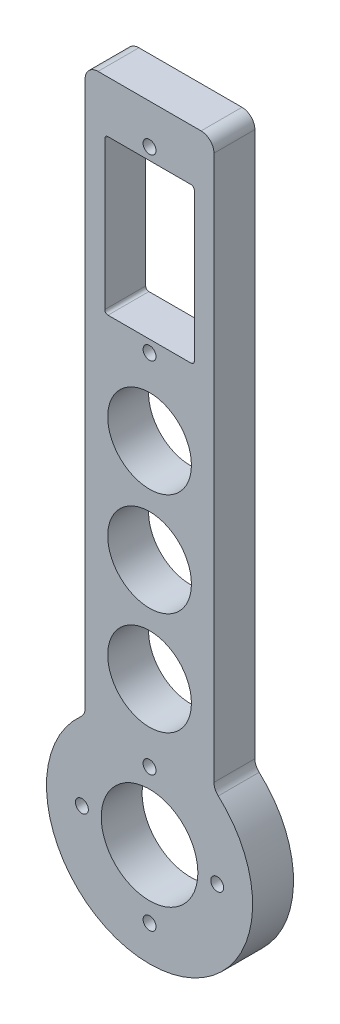
ISO-10303-21;
HEADER;
FILE_DESCRIPTION(('STEP AP214'),'2;1');
FILE_NAME('part.step','',(''),(''),'','','');
FILE_SCHEMA(('AUTOMOTIVE_DESIGN { 1 0 10303 214 1 1 1 1 }'));
ENDSEC;
DATA;
#1=APPLICATION_CONTEXT('core data for automotive mechanical design processes');
#2=APPLICATION_PROTOCOL_DEFINITION('international standard','automotive_design',2000,#1);
#3=PRODUCT_CONTEXT('',#1,'mechanical');
#4=PRODUCT('Part','Part','',(#3));
#5=PRODUCT_RELATED_PRODUCT_CATEGORY('part','',(#4));
#6=PRODUCT_DEFINITION_FORMATION('','',#4);
#7=PRODUCT_DEFINITION_CONTEXT('part definition',#1,'design');
#8=PRODUCT_DEFINITION('design','',#6,#7);
#9=PRODUCT_DEFINITION_SHAPE('','',#8);
#10=(LENGTH_UNIT() NAMED_UNIT(*) SI_UNIT(.MILLI.,.METRE.));
#11=(NAMED_UNIT(*) PLANE_ANGLE_UNIT() SI_UNIT($,.RADIAN.));
#12=(NAMED_UNIT(*) SI_UNIT($,.STERADIAN.) SOLID_ANGLE_UNIT());
#13=UNCERTAINTY_MEASURE_WITH_UNIT(LENGTH_MEASURE(1.E-05),#10,'distance_accuracy_value','');
#14=(GEOMETRIC_REPRESENTATION_CONTEXT(3) GLOBAL_UNCERTAINTY_ASSIGNED_CONTEXT((#13)) GLOBAL_UNIT_ASSIGNED_CONTEXT((#10,
#11,#12)) REPRESENTATION_CONTEXT('',''));
#15=CARTESIAN_POINT('',(0.,0.,0.));
#16=DIRECTION('',(0.,0.,1.));
#17=DIRECTION('',(1.,0.,0.));
#18=AXIS2_PLACEMENT_3D('',#15,#16,#17);
#19=CARTESIAN_POINT('',(0.,0.,3.175));
#20=DIRECTION('',(0.,0.,1.));
#21=DIRECTION('',(1.,0.,0.));
#22=AXIS2_PLACEMENT_3D('',#19,#20,#21);
#23=PLANE('',#22);
#24=CARTESIAN_POINT('',(0.,0.,3.175));
#25=DIRECTION('',(0.,0.,1.));
#26=DIRECTION('',(1.,0.,0.));
#27=AXIS2_PLACEMENT_3D('',#24,#25,#26);
#28=CIRCLE('',#27,7.5);
#29=CARTESIAN_POINT('',(7.5,0.,3.175));
#30=VERTEX_POINT('',#29);
#31=EDGE_CURVE('E605',#30,#30,#28,.T.);
#32=ORIENTED_EDGE('',*,*,#31,.F.);
#33=EDGE_LOOP('',(#32));
#34=FACE_BOUND('',#33,.T.);
#35=CARTESIAN_POINT('',(0.,54.325,3.175));
#36=DIRECTION('',(0.,0.,1.));
#37=DIRECTION('',(1.,0.,0.));
#38=AXIS2_PLACEMENT_3D('',#35,#36,#37);
#39=CIRCLE('',#38,6.5);
#40=CARTESIAN_POINT('',(6.5,54.325,3.175));
#41=VERTEX_POINT('',#40);
#42=EDGE_CURVE('E600',#41,#41,#39,.T.);
#43=ORIENTED_EDGE('',*,*,#42,.F.);
#44=EDGE_LOOP('',(#43));
#45=FACE_BOUND('',#44,.T.);
#46=CARTESIAN_POINT('',(0.,38.325,3.175));
#47=DIRECTION('',(0.,0.,1.));
#48=DIRECTION('',(1.,0.,0.));
#49=AXIS2_PLACEMENT_3D('',#46,#47,#48);
#50=CIRCLE('',#49,6.5);
#51=CARTESIAN_POINT('',(6.5,38.325,3.175));
#52=VERTEX_POINT('',#51);
#53=EDGE_CURVE('E597',#52,#52,#50,.T.);
#54=ORIENTED_EDGE('',*,*,#53,.F.);
#55=EDGE_LOOP('',(#54));
#56=FACE_BOUND('',#55,.T.);
#57=CARTESIAN_POINT('',(0.,22.325,3.175));
#58=DIRECTION('',(0.,0.,1.));
#59=DIRECTION('',(1.,0.,0.));
#60=AXIS2_PLACEMENT_3D('',#57,#58,#59);
#61=CIRCLE('',#60,6.5);
#62=CARTESIAN_POINT('',(6.5,22.325,3.175));
#63=VERTEX_POINT('',#62);
#64=EDGE_CURVE('E590',#63,#63,#61,.T.);
#65=ORIENTED_EDGE('',*,*,#64,.F.);
#66=EDGE_LOOP('',(#65));
#67=FACE_BOUND('',#66,.T.);
#68=DIRECTION('',(0.,1.,0.));
#69=VECTOR('',#68,1.);
#70=CARTESIAN_POINT('',(6.95,68.,3.175));
#71=LINE('',#70,#69);
#72=CARTESIAN_POINT('',(6.95,68.5,3.175));
#73=VERTEX_POINT('',#72);
#74=CARTESIAN_POINT('',(6.95,91.5,3.175));
#75=VERTEX_POINT('',#74);
#76=EDGE_CURVE('E237',#73,#75,#71,.T.);
#77=ORIENTED_EDGE('',*,*,#76,.F.);
#78=CARTESIAN_POINT('',(6.45,68.5,3.175));
#79=DIRECTION('',(0.,0.,1.));
#80=DIRECTION('',(1.,0.,0.));
#81=AXIS2_PLACEMENT_3D('',#78,#79,#80);
#82=CIRCLE('',#81,0.5);
#83=CARTESIAN_POINT('',(6.45,68.,3.175));
#84=VERTEX_POINT('',#83);
#85=EDGE_CURVE('E320',#73,#84,#82,.F.);
#86=ORIENTED_EDGE('',*,*,#85,.T.);
#87=DIRECTION('',(-1.,0.,0.));
#88=VECTOR('',#87,1.);
#89=CARTESIAN_POINT('',(6.95,68.,3.175));
#90=LINE('',#89,#88);
#91=CARTESIAN_POINT('',(-6.45,68.,3.175));
#92=VERTEX_POINT('',#91);
#93=EDGE_CURVE('E239',#84,#92,#90,.T.);
#94=ORIENTED_EDGE('',*,*,#93,.T.);
#95=CARTESIAN_POINT('',(-6.45,68.5,3.175));
#96=DIRECTION('',(0.,0.,1.));
#97=DIRECTION('',(1.,0.,0.));
#98=AXIS2_PLACEMENT_3D('',#95,#96,#97);
#99=CIRCLE('',#98,0.5);
#100=CARTESIAN_POINT('',(-6.95,68.5,3.175));
#101=VERTEX_POINT('',#100);
#102=EDGE_CURVE('E324',#92,#101,#99,.F.);
#103=ORIENTED_EDGE('',*,*,#102,.T.);
#104=DIRECTION('',(0.,1.,0.));
#105=VECTOR('',#104,1.);
#106=CARTESIAN_POINT('',(-6.95,68.,3.175));
#107=LINE('',#106,#105);
#108=CARTESIAN_POINT('',(-6.95,91.5,3.175));
#109=VERTEX_POINT('',#108);
#110=EDGE_CURVE('E236',#101,#109,#107,.T.);
#111=ORIENTED_EDGE('',*,*,#110,.T.);
#112=CARTESIAN_POINT('',(-6.45,91.5,3.175));
#113=DIRECTION('',(0.,0.,1.));
#114=DIRECTION('',(1.,0.,0.));
#115=AXIS2_PLACEMENT_3D('',#112,#113,#114);
#116=CIRCLE('',#115,0.5);
#117=CARTESIAN_POINT('',(-6.45,92.,3.175));
#118=VERTEX_POINT('',#117);
#119=EDGE_CURVE('E235',#109,#118,#116,.F.);
#120=ORIENTED_EDGE('',*,*,#119,.T.);
#121=DIRECTION('',(-1.,0.,0.));
#122=VECTOR('',#121,1.);
#123=CARTESIAN_POINT('',(6.95,92.,3.175));
#124=LINE('',#123,#122);
#125=CARTESIAN_POINT('',(6.45,92.,3.175));
#126=VERTEX_POINT('',#125);
#127=EDGE_CURVE('E226',#126,#118,#124,.T.);
#128=ORIENTED_EDGE('',*,*,#127,.F.);
#129=CARTESIAN_POINT('',(6.45,91.5,3.175));
#130=DIRECTION('',(0.,0.,1.));
#131=DIRECTION('',(1.,0.,0.));
#132=AXIS2_PLACEMENT_3D('',#129,#130,#131);
#133=CIRCLE('',#132,0.5);
#134=EDGE_CURVE('E209',#126,#75,#133,.F.);
#135=ORIENTED_EDGE('',*,*,#134,.T.);
#136=EDGE_LOOP('',(#77,#86,#94,#103,#111,#120,#128,#135));
#137=FACE_BOUND('',#136,.T.);
#138=CARTESIAN_POINT('',(10.5,0.,3.175));
#139=DIRECTION('',(0.,0.,1.));
#140=DIRECTION('',(1.,0.,0.));
#141=AXIS2_PLACEMENT_3D('',#138,#139,#140);
#142=CIRCLE('',#141,1.);
#143=CARTESIAN_POINT('',(11.5,0.,3.175));
#144=VERTEX_POINT('',#143);
#145=EDGE_CURVE('E258',#144,#144,#142,.T.);
#146=ORIENTED_EDGE('',*,*,#145,.F.);
#147=EDGE_LOOP('',(#146));
#148=FACE_BOUND('',#147,.T.);
#149=CARTESIAN_POINT('',(-10.5,0.,3.175));
#150=DIRECTION('',(0.,0.,1.));
#151=DIRECTION('',(1.,0.,0.));
#152=AXIS2_PLACEMENT_3D('',#149,#150,#151);
#153=CIRCLE('',#152,1.);
#154=CARTESIAN_POINT('',(-9.5,0.,3.175));
#155=VERTEX_POINT('',#154);
#156=EDGE_CURVE('E272',#155,#155,#153,.T.);
#157=ORIENTED_EDGE('',*,*,#156,.F.);
#158=EDGE_LOOP('',(#157));
#159=FACE_BOUND('',#158,.T.);
#160=DIRECTION('',(0.,-1.,0.));
#161=VECTOR('',#160,1.);
#162=CARTESIAN_POINT('',(10.,100.,3.175));
#163=LINE('',#162,#161);
#164=CARTESIAN_POINT('',(10.,98.,3.175));
#165=VERTEX_POINT('',#164);
#166=CARTESIAN_POINT('',(10.,13.4164078649988,3.175));
#167=VERTEX_POINT('',#166);
#168=EDGE_CURVE('E287',#165,#167,#163,.T.);
#169=ORIENTED_EDGE('',*,*,#168,.F.);
#170=CARTESIAN_POINT('',(8.,98.,3.175));
#171=DIRECTION('',(0.,0.,1.));
#172=DIRECTION('',(1.,0.,0.));
#173=AXIS2_PLACEMENT_3D('',#170,#171,#172);
#174=CIRCLE('',#173,2.);
#175=CARTESIAN_POINT('',(8.,100.,3.175));
#176=VERTEX_POINT('',#175);
#177=EDGE_CURVE('E346',#165,#176,#174,.T.);
#178=ORIENTED_EDGE('',*,*,#177,.T.);
#179=DIRECTION('',(1.,0.,0.));
#180=VECTOR('',#179,1.);
#181=CARTESIAN_POINT('',(-10.,100.,3.175));
#182=LINE('',#181,#180);
#183=CARTESIAN_POINT('',(-8.,100.,3.175));
#184=VERTEX_POINT('',#183);
#185=EDGE_CURVE('E291',#184,#176,#182,.T.);
#186=ORIENTED_EDGE('',*,*,#185,.F.);
#187=CARTESIAN_POINT('',(-8.,98.,3.175));
#188=DIRECTION('',(0.,0.,1.));
#189=DIRECTION('',(1.,0.,0.));
#190=AXIS2_PLACEMENT_3D('',#187,#188,#189);
#191=CIRCLE('',#190,2.);
#192=CARTESIAN_POINT('',(-10.,98.,3.175));
#193=VERTEX_POINT('',#192);
#194=EDGE_CURVE('E110',#184,#193,#191,.T.);
#195=ORIENTED_EDGE('',*,*,#194,.T.);
#196=DIRECTION('',(0.,1.,0.));
#197=VECTOR('',#196,1.);
#198=CARTESIAN_POINT('',(-10.,12.4899959967968,3.175));
#199=LINE('',#198,#197);
#200=CARTESIAN_POINT('',(-10.,13.4164078649987,3.175));
#201=VERTEX_POINT('',#200);
#202=EDGE_CURVE('E294',#201,#193,#199,.T.);
#203=ORIENTED_EDGE('',*,*,#202,.F.);
#204=CARTESIAN_POINT('',(-12.,13.4164078649987,3.175));
#205=DIRECTION('',(0.,0.,1.));
#206=DIRECTION('',(1.,0.,0.));
#207=AXIS2_PLACEMENT_3D('',#204,#205,#206);
#208=CIRCLE('',#207,2.);
#209=CARTESIAN_POINT('',(-10.6666666666667,11.9256958799989,3.175));
#210=VERTEX_POINT('',#209);
#211=EDGE_CURVE('E359',#201,#210,#208,.F.);
#212=ORIENTED_EDGE('',*,*,#211,.T.);
#213=CARTESIAN_POINT('',(0.,0.,3.175));
#214=DIRECTION('',(0.,0.,1.));
#215=DIRECTION('',(1.,0.,0.));
#216=AXIS2_PLACEMENT_3D('',#213,#214,#215);
#217=CIRCLE('',#216,16.);
#218=CARTESIAN_POINT('',(10.6666666666667,11.9256958799989,3.175));
#219=VERTEX_POINT('',#218);
#220=EDGE_CURVE('E284',#210,#219,#217,.T.);
#221=ORIENTED_EDGE('',*,*,#220,.T.);
#222=CARTESIAN_POINT('',(12.,13.4164078649987,3.175));
#223=DIRECTION('',(0.,0.,1.));
#224=DIRECTION('',(1.,0.,0.));
#225=AXIS2_PLACEMENT_3D('',#222,#223,#224);
#226=CIRCLE('',#225,2.);
#227=EDGE_CURVE('E13',#219,#167,#226,.F.);
#228=ORIENTED_EDGE('',*,*,#227,.T.);
#229=EDGE_LOOP('',(#169,#178,#186,#195,#203,#212,#221,#228));
#230=FACE_BOUND('',#229,.T.);
#231=CARTESIAN_POINT('',(0.,10.5,3.175));
#232=DIRECTION('',(0.,0.,1.));
#233=DIRECTION('',(1.,0.,0.));
#234=AXIS2_PLACEMENT_3D('',#231,#232,#233);
#235=CIRCLE('',#234,1.00000000000001);
#236=CARTESIAN_POINT('',(1.00000000000001,10.5,3.175));
#237=VERTEX_POINT('',#236);
#238=EDGE_CURVE('E278',#237,#237,#235,.T.);
#239=ORIENTED_EDGE('',*,*,#238,.F.);
#240=EDGE_LOOP('',(#239));
#241=FACE_BOUND('',#240,.T.);
#242=CARTESIAN_POINT('',(0.,-10.5,3.175));
#243=DIRECTION('',(0.,0.,1.));
#244=DIRECTION('',(1.,0.,0.));
#245=AXIS2_PLACEMENT_3D('',#242,#243,#244);
#246=CIRCLE('',#245,1.00000000000004);
#247=CARTESIAN_POINT('',(1.00000000000003,-10.5,3.175));
#248=VERTEX_POINT('',#247);
#249=EDGE_CURVE('E266',#248,#248,#246,.T.);
#250=ORIENTED_EDGE('',*,*,#249,.F.);
#251=EDGE_LOOP('',(#250));
#252=FACE_BOUND('',#251,.T.);
#253=CARTESIAN_POINT('',(0.,66.15,3.175));
#254=DIRECTION('',(0.,0.,1.));
#255=DIRECTION('',(1.,0.,0.));
#256=AXIS2_PLACEMENT_3D('',#253,#254,#255);
#257=CIRCLE('',#256,1.);
#258=CARTESIAN_POINT('',(1.,66.15,3.175));
#259=VERTEX_POINT('',#258);
#260=EDGE_CURVE('E567',#259,#259,#257,.T.);
#261=ORIENTED_EDGE('',*,*,#260,.F.);
#262=EDGE_LOOP('',(#261));
#263=FACE_BOUND('',#262,.T.);
#264=CARTESIAN_POINT('',(0.,93.85,3.175));
#265=DIRECTION('',(0.,0.,1.));
#266=DIRECTION('',(1.,0.,0.));
#267=AXIS2_PLACEMENT_3D('',#264,#265,#266);
#268=CIRCLE('',#267,1.);
#269=CARTESIAN_POINT('',(1.,93.85,3.175));
#270=VERTEX_POINT('',#269);
#271=EDGE_CURVE('E570',#270,#270,#268,.F.);
#272=ORIENTED_EDGE('',*,*,#271,.T.);
#273=EDGE_LOOP('',(#272));
#274=FACE_BOUND('',#273,.T.);
#275=ADVANCED_FACE('F95',(#34,#45,#56,#67,#137,#148,#159,#230,#241,#252,#263,#274),#23,.T.);
#276=CARTESIAN_POINT('',(0.,0.,-3.175));
#277=DIRECTION('',(0.,0.,1.));
#278=DIRECTION('',(1.,0.,0.));
#279=AXIS2_PLACEMENT_3D('',#276,#277,#278);
#280=PLANE('',#279);
#281=CARTESIAN_POINT('',(0.,0.,-3.175));
#282=DIRECTION('',(0.,0.,1.));
#283=DIRECTION('',(1.,0.,0.));
#284=AXIS2_PLACEMENT_3D('',#281,#282,#283);
#285=CIRCLE('',#284,7.5);
#286=CARTESIAN_POINT('',(7.5,0.,-3.175));
#287=VERTEX_POINT('',#286);
#288=EDGE_CURVE('E591',#287,#287,#285,.T.);
#289=ORIENTED_EDGE('',*,*,#288,.T.);
#290=EDGE_LOOP('',(#289));
#291=FACE_BOUND('',#290,.T.);
#292=CARTESIAN_POINT('',(0.,54.325,-3.175));
#293=DIRECTION('',(0.,0.,1.));
#294=DIRECTION('',(1.,0.,0.));
#295=AXIS2_PLACEMENT_3D('',#292,#293,#294);
#296=CIRCLE('',#295,6.5);
#297=CARTESIAN_POINT('',(6.5,54.325,-3.175));
#298=VERTEX_POINT('',#297);
#299=EDGE_CURVE('E251',#298,#298,#296,.T.);
#300=ORIENTED_EDGE('',*,*,#299,.T.);
#301=EDGE_LOOP('',(#300));
#302=FACE_BOUND('',#301,.T.);
#303=CARTESIAN_POINT('',(0.,38.325,-3.175));
#304=DIRECTION('',(0.,0.,1.));
#305=DIRECTION('',(1.,0.,0.));
#306=AXIS2_PLACEMENT_3D('',#303,#304,#305);
#307=CIRCLE('',#306,6.5);
#308=CARTESIAN_POINT('',(6.5,38.325,-3.175));
#309=VERTEX_POINT('',#308);
#310=EDGE_CURVE('E594',#309,#309,#307,.T.);
#311=ORIENTED_EDGE('',*,*,#310,.T.);
#312=EDGE_LOOP('',(#311));
#313=FACE_BOUND('',#312,.T.);
#314=CARTESIAN_POINT('',(0.,22.325,-3.175));
#315=DIRECTION('',(0.,0.,1.));
#316=DIRECTION('',(1.,0.,0.));
#317=AXIS2_PLACEMENT_3D('',#314,#315,#316);
#318=CIRCLE('',#317,6.5);
#319=CARTESIAN_POINT('',(6.5,22.325,-3.175));
#320=VERTEX_POINT('',#319);
#321=EDGE_CURVE('E587',#320,#320,#318,.T.);
#322=ORIENTED_EDGE('',*,*,#321,.T.);
#323=EDGE_LOOP('',(#322));
#324=FACE_BOUND('',#323,.T.);
#325=CARTESIAN_POINT('',(0.,66.15,-3.175));
#326=DIRECTION('',(0.,0.,1.));
#327=DIRECTION('',(1.,0.,0.));
#328=AXIS2_PLACEMENT_3D('',#325,#326,#327);
#329=CIRCLE('',#328,1.);
#330=CARTESIAN_POINT('',(1.,66.15,-3.175));
#331=VERTEX_POINT('',#330);
#332=EDGE_CURVE('E247',#331,#331,#329,.T.);
#333=ORIENTED_EDGE('',*,*,#332,.T.);
#334=EDGE_LOOP('',(#333));
#335=FACE_BOUND('',#334,.T.);
#336=CARTESIAN_POINT('',(10.5,0.,-3.175));
#337=DIRECTION('',(0.,0.,1.));
#338=DIRECTION('',(1.,0.,0.));
#339=AXIS2_PLACEMENT_3D('',#336,#337,#338);
#340=CIRCLE('',#339,1.);
#341=CARTESIAN_POINT('',(11.5,0.,-3.175));
#342=VERTEX_POINT('',#341);
#343=EDGE_CURVE('E262',#342,#342,#340,.T.);
#344=ORIENTED_EDGE('',*,*,#343,.T.);
#345=EDGE_LOOP('',(#344));
#346=FACE_BOUND('',#345,.T.);
#347=CARTESIAN_POINT('',(0.,-10.5,-3.175));
#348=DIRECTION('',(0.,0.,1.));
#349=DIRECTION('',(1.,0.,0.));
#350=AXIS2_PLACEMENT_3D('',#347,#348,#349);
#351=CIRCLE('',#350,1.00000000000004);
#352=CARTESIAN_POINT('',(1.00000000000003,-10.5,-3.175));
#353=VERTEX_POINT('',#352);
#354=EDGE_CURVE('E261',#353,#353,#351,.T.);
#355=ORIENTED_EDGE('',*,*,#354,.T.);
#356=EDGE_LOOP('',(#355));
#357=FACE_BOUND('',#356,.T.);
#358=CARTESIAN_POINT('',(-10.5,0.,-3.175));
#359=DIRECTION('',(0.,0.,1.));
#360=DIRECTION('',(1.,0.,0.));
#361=AXIS2_PLACEMENT_3D('',#358,#359,#360);
#362=CIRCLE('',#361,1.);
#363=CARTESIAN_POINT('',(-9.5,0.,-3.175));
#364=VERTEX_POINT('',#363);
#365=EDGE_CURVE('E269',#364,#364,#362,.T.);
#366=ORIENTED_EDGE('',*,*,#365,.T.);
#367=EDGE_LOOP('',(#366));
#368=FACE_BOUND('',#367,.T.);
#369=CARTESIAN_POINT('',(0.,10.5,-3.175));
#370=DIRECTION('',(0.,0.,1.));
#371=DIRECTION('',(1.,0.,0.));
#372=AXIS2_PLACEMENT_3D('',#369,#370,#371);
#373=CIRCLE('',#372,1.00000000000001);
#374=CARTESIAN_POINT('',(1.00000000000001,10.5,-3.175));
#375=VERTEX_POINT('',#374);
#376=EDGE_CURVE('E275',#375,#375,#373,.T.);
#377=ORIENTED_EDGE('',*,*,#376,.T.);
#378=EDGE_LOOP('',(#377));
#379=FACE_BOUND('',#378,.T.);
#380=DIRECTION('',(1.,0.,0.));
#381=VECTOR('',#380,1.);
#382=CARTESIAN_POINT('',(-10.,100.,-3.175));
#383=LINE('',#382,#381);
#384=CARTESIAN_POINT('',(-8.,100.,-3.175));
#385=VERTEX_POINT('',#384);
#386=CARTESIAN_POINT('',(8.,100.,-3.175));
#387=VERTEX_POINT('',#386);
#388=EDGE_CURVE('E301',#385,#387,#383,.T.);
#389=ORIENTED_EDGE('',*,*,#388,.T.);
#390=CARTESIAN_POINT('',(8.,98.,-3.175));
#391=DIRECTION('',(0.,0.,1.));
#392=DIRECTION('',(1.,0.,0.));
#393=AXIS2_PLACEMENT_3D('',#390,#391,#392);
#394=CIRCLE('',#393,2.);
#395=CARTESIAN_POINT('',(10.,98.,-3.175));
#396=VERTEX_POINT('',#395);
#397=EDGE_CURVE('E338',#387,#396,#394,.F.);
#398=ORIENTED_EDGE('',*,*,#397,.T.);
#399=DIRECTION('',(0.,-1.,0.));
#400=VECTOR('',#399,1.);
#401=CARTESIAN_POINT('',(10.,100.,-3.175));
#402=LINE('',#401,#400);
#403=CARTESIAN_POINT('',(10.,13.4164078649988,-3.175));
#404=VERTEX_POINT('',#403);
#405=EDGE_CURVE('E298',#396,#404,#402,.T.);
#406=ORIENTED_EDGE('',*,*,#405,.T.);
#407=CARTESIAN_POINT('',(12.,13.4164078649987,-3.175));
#408=DIRECTION('',(0.,0.,1.));
#409=DIRECTION('',(1.,0.,0.));
#410=AXIS2_PLACEMENT_3D('',#407,#408,#409);
#411=CIRCLE('',#410,2.);
#412=CARTESIAN_POINT('',(10.6666666666667,11.9256958799989,-3.175));
#413=VERTEX_POINT('',#412);
#414=EDGE_CURVE('E103',#404,#413,#411,.T.);
#415=ORIENTED_EDGE('',*,*,#414,.T.);
#416=CARTESIAN_POINT('',(0.,0.,-3.175));
#417=DIRECTION('',(0.,0.,1.));
#418=DIRECTION('',(1.,0.,0.));
#419=AXIS2_PLACEMENT_3D('',#416,#417,#418);
#420=CIRCLE('',#419,16.);
#421=CARTESIAN_POINT('',(-10.6666666666667,11.9256958799989,-3.175));
#422=VERTEX_POINT('',#421);
#423=EDGE_CURVE('E281',#422,#413,#420,.T.);
#424=ORIENTED_EDGE('',*,*,#423,.F.);
#425=CARTESIAN_POINT('',(-12.,13.4164078649987,-3.175));
#426=DIRECTION('',(0.,0.,1.));
#427=DIRECTION('',(1.,0.,0.));
#428=AXIS2_PLACEMENT_3D('',#425,#426,#427);
#429=CIRCLE('',#428,2.);
#430=CARTESIAN_POINT('',(-10.,13.4164078649987,-3.175));
#431=VERTEX_POINT('',#430);
#432=EDGE_CURVE('E357',#422,#431,#429,.T.);
#433=ORIENTED_EDGE('',*,*,#432,.T.);
#434=DIRECTION('',(0.,1.,0.));
#435=VECTOR('',#434,1.);
#436=CARTESIAN_POINT('',(-10.,12.4899959967968,-3.175));
#437=LINE('',#436,#435);
#438=CARTESIAN_POINT('',(-10.,98.,-3.175));
#439=VERTEX_POINT('',#438);
#440=EDGE_CURVE('E288',#431,#439,#437,.T.);
#441=ORIENTED_EDGE('',*,*,#440,.T.);
#442=CARTESIAN_POINT('',(-8.,98.,-3.175));
#443=DIRECTION('',(0.,0.,1.));
#444=DIRECTION('',(1.,0.,0.));
#445=AXIS2_PLACEMENT_3D('',#442,#443,#444);
#446=CIRCLE('',#445,2.);
#447=EDGE_CURVE('E336',#439,#385,#446,.F.);
#448=ORIENTED_EDGE('',*,*,#447,.T.);
#449=EDGE_LOOP('',(#389,#398,#406,#415,#424,#433,#441,#448));
#450=FACE_BOUND('',#449,.T.);
#451=DIRECTION('',(-1.,0.,0.));
#452=VECTOR('',#451,1.);
#453=CARTESIAN_POINT('',(6.95,68.,-3.175));
#454=LINE('',#453,#452);
#455=CARTESIAN_POINT('',(6.45,68.,-3.175));
#456=VERTEX_POINT('',#455);
#457=CARTESIAN_POINT('',(-6.45,68.,-3.175));
#458=VERTEX_POINT('',#457);
#459=EDGE_CURVE('E241',#456,#458,#454,.T.);
#460=ORIENTED_EDGE('',*,*,#459,.F.);
#461=CARTESIAN_POINT('',(6.45,68.5,-3.175));
#462=DIRECTION('',(0.,0.,1.));
#463=DIRECTION('',(1.,0.,0.));
#464=AXIS2_PLACEMENT_3D('',#461,#462,#463);
#465=CIRCLE('',#464,0.5);
#466=CARTESIAN_POINT('',(6.95,68.5,-3.175));
#467=VERTEX_POINT('',#466);
#468=EDGE_CURVE('E322',#456,#467,#465,.T.);
#469=ORIENTED_EDGE('',*,*,#468,.T.);
#470=DIRECTION('',(0.,1.,0.));
#471=VECTOR('',#470,1.);
#472=CARTESIAN_POINT('',(6.95,68.,-3.175));
#473=LINE('',#472,#471);
#474=CARTESIAN_POINT('',(6.95,91.5,-3.175));
#475=VERTEX_POINT('',#474);
#476=EDGE_CURVE('E248',#467,#475,#473,.T.);
#477=ORIENTED_EDGE('',*,*,#476,.T.);
#478=CARTESIAN_POINT('',(6.45,91.5,-3.175));
#479=DIRECTION('',(0.,0.,1.));
#480=DIRECTION('',(1.,0.,0.));
#481=AXIS2_PLACEMENT_3D('',#478,#479,#480);
#482=CIRCLE('',#481,0.5);
#483=CARTESIAN_POINT('',(6.45,92.,-3.175));
#484=VERTEX_POINT('',#483);
#485=EDGE_CURVE('E219',#475,#484,#482,.T.);
#486=ORIENTED_EDGE('',*,*,#485,.T.);
#487=DIRECTION('',(-1.,0.,0.));
#488=VECTOR('',#487,1.);
#489=CARTESIAN_POINT('',(6.95,92.,-3.175));
#490=LINE('',#489,#488);
#491=CARTESIAN_POINT('',(-6.45,92.,-3.175));
#492=VERTEX_POINT('',#491);
#493=EDGE_CURVE('E229',#484,#492,#490,.T.);
#494=ORIENTED_EDGE('',*,*,#493,.T.);
#495=CARTESIAN_POINT('',(-6.45,91.5,-3.175));
#496=DIRECTION('',(0.,0.,1.));
#497=DIRECTION('',(1.,0.,0.));
#498=AXIS2_PLACEMENT_3D('',#495,#496,#497);
#499=CIRCLE('',#498,0.5);
#500=CARTESIAN_POINT('',(-6.95,91.5,-3.175));
#501=VERTEX_POINT('',#500);
#502=EDGE_CURVE('E329',#492,#501,#499,.T.);
#503=ORIENTED_EDGE('',*,*,#502,.T.);
#504=DIRECTION('',(0.,1.,0.));
#505=VECTOR('',#504,1.);
#506=CARTESIAN_POINT('',(-6.95,68.,-3.175));
#507=LINE('',#506,#505);
#508=CARTESIAN_POINT('',(-6.95,68.5,-3.175));
#509=VERTEX_POINT('',#508);
#510=EDGE_CURVE('E253',#509,#501,#507,.T.);
#511=ORIENTED_EDGE('',*,*,#510,.F.);
#512=CARTESIAN_POINT('',(-6.45,68.5,-3.175));
#513=DIRECTION('',(0.,0.,1.));
#514=DIRECTION('',(1.,0.,0.));
#515=AXIS2_PLACEMENT_3D('',#512,#513,#514);
#516=CIRCLE('',#515,0.5);
#517=EDGE_CURVE('E326',#509,#458,#516,.T.);
#518=ORIENTED_EDGE('',*,*,#517,.T.);
#519=EDGE_LOOP('',(#460,#469,#477,#486,#494,#503,#511,#518));
#520=FACE_BOUND('',#519,.T.);
#521=CARTESIAN_POINT('',(0.,93.85,-3.175));
#522=DIRECTION('',(0.,0.,1.));
#523=DIRECTION('',(1.,0.,0.));
#524=AXIS2_PLACEMENT_3D('',#521,#522,#523);
#525=CIRCLE('',#524,1.);
#526=CARTESIAN_POINT('',(1.,93.85,-3.175));
#527=VERTEX_POINT('',#526);
#528=EDGE_CURVE('E265',#527,#527,#525,.F.);
#529=ORIENTED_EDGE('',*,*,#528,.F.);
#530=EDGE_LOOP('',(#529));
#531=FACE_BOUND('',#530,.T.);
#532=ADVANCED_FACE('F362',(#291,#302,#313,#324,#335,#346,#357,#368,#379,#450,#520,#531),#280,.F.);
#533=CARTESIAN_POINT('',(0.,0.,3.175));
#534=DIRECTION('',(0.,0.,-1.));
#535=DIRECTION('',(-1.,0.,0.));
#536=AXIS2_PLACEMENT_3D('',#533,#534,#535);
#537=CYLINDRICAL_SURFACE('',#536,16.);
#538=ORIENTED_EDGE('',*,*,#220,.F.);
#539=DIRECTION('',(0.,0.,-1.));
#540=VECTOR('',#539,1.);
#541=CARTESIAN_POINT('',(-10.6666666666667,11.9256958799989,3.175));
#542=LINE('',#541,#540);
#543=EDGE_CURVE('E354',#210,#422,#542,.T.);
#544=ORIENTED_EDGE('',*,*,#543,.T.);
#545=ORIENTED_EDGE('',*,*,#423,.T.);
#546=DIRECTION('',(0.,0.,-1.));
#547=VECTOR('',#546,1.);
#548=CARTESIAN_POINT('',(10.6666666666667,11.9256958799989,3.175));
#549=LINE('',#548,#547);
#550=EDGE_CURVE('E352',#413,#219,#549,.F.);
#551=ORIENTED_EDGE('',*,*,#550,.T.);
#552=EDGE_LOOP('',(#538,#544,#545,#551));
#553=FACE_BOUND('',#552,.T.);
#554=ADVANCED_FACE('F370',(#553),#537,.T.);
#555=CARTESIAN_POINT('',(10.,100.,3.175));
#556=DIRECTION('',(1.,0.,0.));
#557=DIRECTION('',(0.,1.,0.));
#558=AXIS2_PLACEMENT_3D('',#555,#556,#557);
#559=PLANE('',#558);
#560=ORIENTED_EDGE('',*,*,#405,.F.);
#561=DIRECTION('',(0.,0.,-1.));
#562=VECTOR('',#561,1.);
#563=CARTESIAN_POINT('',(10.,98.,3.175));
#564=LINE('',#563,#562);
#565=EDGE_CURVE('E343',#396,#165,#564,.F.);
#566=ORIENTED_EDGE('',*,*,#565,.T.);
#567=ORIENTED_EDGE('',*,*,#168,.T.);
#568=DIRECTION('',(0.,0.,-1.));
#569=VECTOR('',#568,1.);
#570=CARTESIAN_POINT('',(10.,13.4164078649987,3.175));
#571=LINE('',#570,#569);
#572=EDGE_CURVE('E340',#167,#404,#571,.T.);
#573=ORIENTED_EDGE('',*,*,#572,.T.);
#574=EDGE_LOOP('',(#560,#566,#567,#573));
#575=FACE_BOUND('',#574,.T.);
#576=ADVANCED_FACE('F377',(#575),#559,.T.);
#577=CARTESIAN_POINT('',(-10.,100.,3.175));
#578=DIRECTION('',(0.,1.,0.));
#579=DIRECTION('',(0.,0.,1.));
#580=AXIS2_PLACEMENT_3D('',#577,#578,#579);
#581=PLANE('',#580);
#582=ORIENTED_EDGE('',*,*,#185,.T.);
#583=DIRECTION('',(0.,0.,-1.));
#584=VECTOR('',#583,1.);
#585=CARTESIAN_POINT('',(8.,100.,3.175));
#586=LINE('',#585,#584);
#587=EDGE_CURVE('E333',#176,#387,#586,.T.);
#588=ORIENTED_EDGE('',*,*,#587,.T.);
#589=ORIENTED_EDGE('',*,*,#388,.F.);
#590=DIRECTION('',(0.,0.,-1.));
#591=VECTOR('',#590,1.);
#592=CARTESIAN_POINT('',(-8.,100.,3.175));
#593=LINE('',#592,#591);
#594=EDGE_CURVE('E331',#385,#184,#593,.F.);
#595=ORIENTED_EDGE('',*,*,#594,.T.);
#596=EDGE_LOOP('',(#582,#588,#589,#595));
#597=FACE_BOUND('',#596,.T.);
#598=ADVANCED_FACE('F383',(#597),#581,.T.);
#599=CARTESIAN_POINT('',(-10.,12.4899959967968,3.175));
#600=DIRECTION('',(-1.,0.,0.));
#601=DIRECTION('',(0.,-1.,0.));
#602=AXIS2_PLACEMENT_3D('',#599,#600,#601);
#603=PLANE('',#602);
#604=ORIENTED_EDGE('',*,*,#202,.T.);
#605=DIRECTION('',(0.,0.,-1.));
#606=VECTOR('',#605,1.);
#607=CARTESIAN_POINT('',(-10.,98.,3.175));
#608=LINE('',#607,#606);
#609=EDGE_CURVE('E349',#193,#439,#608,.T.);
#610=ORIENTED_EDGE('',*,*,#609,.T.);
#611=ORIENTED_EDGE('',*,*,#440,.F.);
#612=DIRECTION('',(0.,0.,-1.));
#613=VECTOR('',#612,1.);
#614=CARTESIAN_POINT('',(-10.,13.4164078649987,3.175));
#615=LINE('',#614,#613);
#616=EDGE_CURVE('E117',#431,#201,#615,.F.);
#617=ORIENTED_EDGE('',*,*,#616,.T.);
#618=EDGE_LOOP('',(#604,#610,#611,#617));
#619=FACE_BOUND('',#618,.T.);
#620=ADVANCED_FACE('F389',(#619),#603,.T.);
#621=CARTESIAN_POINT('',(0.,10.5,3.175));
#622=DIRECTION('',(0.,0.,-1.));
#623=DIRECTION('',(-1.,0.,0.));
#624=AXIS2_PLACEMENT_3D('',#621,#622,#623);
#625=CYLINDRICAL_SURFACE('',#624,1.00000000000001);
#626=ORIENTED_EDGE('',*,*,#238,.T.);
#627=EDGE_LOOP('',(#626));
#628=FACE_BOUND('',#627,.T.);
#629=ORIENTED_EDGE('',*,*,#376,.F.);
#630=EDGE_LOOP('',(#629));
#631=FACE_BOUND('',#630,.T.);
#632=ADVANCED_FACE('F411',(#628,#631),#625,.F.);
#633=CARTESIAN_POINT('',(-10.5,0.,3.175));
#634=DIRECTION('',(0.,0.,-1.));
#635=DIRECTION('',(-1.,0.,0.));
#636=AXIS2_PLACEMENT_3D('',#633,#634,#635);
#637=CYLINDRICAL_SURFACE('',#636,1.);
#638=ORIENTED_EDGE('',*,*,#156,.T.);
#639=EDGE_LOOP('',(#638));
#640=FACE_BOUND('',#639,.T.);
#641=ORIENTED_EDGE('',*,*,#365,.F.);
#642=EDGE_LOOP('',(#641));
#643=FACE_BOUND('',#642,.T.);
#644=ADVANCED_FACE('F542',(#640,#643),#637,.F.);
#645=CARTESIAN_POINT('',(0.,-10.5,3.175));
#646=DIRECTION('',(0.,0.,-1.));
#647=DIRECTION('',(-1.,0.,0.));
#648=AXIS2_PLACEMENT_3D('',#645,#646,#647);
#649=CYLINDRICAL_SURFACE('',#648,1.00000000000004);
#650=ORIENTED_EDGE('',*,*,#249,.T.);
#651=EDGE_LOOP('',(#650));
#652=FACE_BOUND('',#651,.T.);
#653=ORIENTED_EDGE('',*,*,#354,.F.);
#654=EDGE_LOOP('',(#653));
#655=FACE_BOUND('',#654,.T.);
#656=ADVANCED_FACE('F539',(#652,#655),#649,.F.);
#657=CARTESIAN_POINT('',(10.5,0.,3.175));
#658=DIRECTION('',(0.,0.,-1.));
#659=DIRECTION('',(-1.,0.,0.));
#660=AXIS2_PLACEMENT_3D('',#657,#658,#659);
#661=CYLINDRICAL_SURFACE('',#660,1.);
#662=ORIENTED_EDGE('',*,*,#145,.T.);
#663=EDGE_LOOP('',(#662));
#664=FACE_BOUND('',#663,.T.);
#665=ORIENTED_EDGE('',*,*,#343,.F.);
#666=EDGE_LOOP('',(#665));
#667=FACE_BOUND('',#666,.T.);
#668=ADVANCED_FACE('F527',(#664,#667),#661,.F.);
#669=CARTESIAN_POINT('',(6.95,68.,-3.175));
#670=DIRECTION('',(0.,1.,0.));
#671=DIRECTION('',(-1.,0.,0.));
#672=AXIS2_PLACEMENT_3D('',#669,#670,#671);
#673=PLANE('',#672);
#674=ORIENTED_EDGE('',*,*,#93,.F.);
#675=DIRECTION('',(0.,0.,1.));
#676=VECTOR('',#675,1.);
#677=CARTESIAN_POINT('',(6.45,68.,-3.175));
#678=LINE('',#677,#676);
#679=EDGE_CURVE('E313',#84,#456,#678,.F.);
#680=ORIENTED_EDGE('',*,*,#679,.T.);
#681=ORIENTED_EDGE('',*,*,#459,.T.);
#682=DIRECTION('',(0.,0.,1.));
#683=VECTOR('',#682,1.);
#684=CARTESIAN_POINT('',(-6.45,68.,3.175));
#685=LINE('',#684,#683);
#686=EDGE_CURVE('E310',#458,#92,#685,.T.);
#687=ORIENTED_EDGE('',*,*,#686,.T.);
#688=EDGE_LOOP('',(#674,#680,#681,#687));
#689=FACE_BOUND('',#688,.T.);
#690=ADVANCED_FACE('F523',(#689),#673,.T.);
#691=CARTESIAN_POINT('',(-6.95,68.,-3.175));
#692=DIRECTION('',(1.,0.,0.));
#693=DIRECTION('',(0.,0.,-1.));
#694=AXIS2_PLACEMENT_3D('',#691,#692,#693);
#695=PLANE('',#694);
#696=ORIENTED_EDGE('',*,*,#110,.F.);
#697=DIRECTION('',(0.,0.,1.));
#698=VECTOR('',#697,1.);
#699=CARTESIAN_POINT('',(-6.95,68.5,-3.175));
#700=LINE('',#699,#698);
#701=EDGE_CURVE('E220',#101,#509,#700,.F.);
#702=ORIENTED_EDGE('',*,*,#701,.T.);
#703=ORIENTED_EDGE('',*,*,#510,.T.);
#704=DIRECTION('',(0.,0.,1.));
#705=VECTOR('',#704,1.);
#706=CARTESIAN_POINT('',(-6.95,91.5,-3.175));
#707=LINE('',#706,#705);
#708=EDGE_CURVE('E315',#501,#109,#707,.T.);
#709=ORIENTED_EDGE('',*,*,#708,.T.);
#710=EDGE_LOOP('',(#696,#702,#703,#709));
#711=FACE_BOUND('',#710,.T.);
#712=ADVANCED_FACE('F526',(#711),#695,.T.);
#713=CARTESIAN_POINT('',(6.95,92.,-3.175));
#714=DIRECTION('',(0.,1.,0.));
#715=DIRECTION('',(0.,0.,1.));
#716=AXIS2_PLACEMENT_3D('',#713,#714,#715);
#717=PLANE('',#716);
#718=ORIENTED_EDGE('',*,*,#493,.F.);
#719=DIRECTION('',(0.,0.,1.));
#720=VECTOR('',#719,1.);
#721=CARTESIAN_POINT('',(6.45,92.,3.175));
#722=LINE('',#721,#720);
#723=EDGE_CURVE('E213',#484,#126,#722,.T.);
#724=ORIENTED_EDGE('',*,*,#723,.T.);
#725=ORIENTED_EDGE('',*,*,#127,.T.);
#726=DIRECTION('',(0.,0.,1.));
#727=VECTOR('',#726,1.);
#728=CARTESIAN_POINT('',(-6.45,92.,-3.175));
#729=LINE('',#728,#727);
#730=EDGE_CURVE('E231',#118,#492,#729,.F.);
#731=ORIENTED_EDGE('',*,*,#730,.T.);
#732=EDGE_LOOP('',(#718,#724,#725,#731));
#733=FACE_BOUND('',#732,.T.);
#734=ADVANCED_FACE('F225',(#733),#717,.F.);
#735=CARTESIAN_POINT('',(6.95,68.,-3.175));
#736=DIRECTION('',(1.,0.,0.));
#737=DIRECTION('',(0.,0.,-1.));
#738=AXIS2_PLACEMENT_3D('',#735,#736,#737);
#739=PLANE('',#738);
#740=ORIENTED_EDGE('',*,*,#76,.T.);
#741=DIRECTION('',(0.,0.,1.));
#742=VECTOR('',#741,1.);
#743=CARTESIAN_POINT('',(6.95,91.5,-3.175));
#744=LINE('',#743,#742);
#745=EDGE_CURVE('E214',#75,#475,#744,.F.);
#746=ORIENTED_EDGE('',*,*,#745,.T.);
#747=ORIENTED_EDGE('',*,*,#476,.F.);
#748=DIRECTION('',(0.,0.,1.));
#749=VECTOR('',#748,1.);
#750=CARTESIAN_POINT('',(6.95,68.5,-3.175));
#751=LINE('',#750,#749);
#752=EDGE_CURVE('E230',#467,#73,#751,.T.);
#753=ORIENTED_EDGE('',*,*,#752,.T.);
#754=EDGE_LOOP('',(#740,#746,#747,#753));
#755=FACE_BOUND('',#754,.T.);
#756=ADVANCED_FACE('F521',(#755),#739,.F.);
#757=CARTESIAN_POINT('',(0.,66.15,-3.175));
#758=DIRECTION('',(0.,0.,1.));
#759=DIRECTION('',(1.,0.,0.));
#760=AXIS2_PLACEMENT_3D('',#757,#758,#759);
#761=CYLINDRICAL_SURFACE('',#760,1.);
#762=ORIENTED_EDGE('',*,*,#332,.F.);
#763=EDGE_LOOP('',(#762));
#764=FACE_BOUND('',#763,.T.);
#765=ORIENTED_EDGE('',*,*,#260,.T.);
#766=EDGE_LOOP('',(#765));
#767=FACE_BOUND('',#766,.T.);
#768=ADVANCED_FACE('F517',(#764,#767),#761,.F.);
#769=CARTESIAN_POINT('',(0.,93.85,-3.175));
#770=DIRECTION('',(0.,0.,1.));
#771=DIRECTION('',(1.,0.,0.));
#772=AXIS2_PLACEMENT_3D('',#769,#770,#771);
#773=CYLINDRICAL_SURFACE('',#772,1.);
#774=ORIENTED_EDGE('',*,*,#528,.T.);
#775=EDGE_LOOP('',(#774));
#776=FACE_BOUND('',#775,.T.);
#777=ORIENTED_EDGE('',*,*,#271,.F.);
#778=EDGE_LOOP('',(#777));
#779=FACE_BOUND('',#778,.T.);
#780=ADVANCED_FACE('F425',(#776,#779),#773,.F.);
#781=CARTESIAN_POINT('',(6.45,91.5,-3.175));
#782=DIRECTION('',(0.,0.,-1.));
#783=DIRECTION('',(-1.,0.,0.));
#784=AXIS2_PLACEMENT_3D('',#781,#782,#783);
#785=CYLINDRICAL_SURFACE('',#784,0.5);
#786=ORIENTED_EDGE('',*,*,#485,.F.);
#787=ORIENTED_EDGE('',*,*,#745,.F.);
#788=ORIENTED_EDGE('',*,*,#134,.F.);
#789=ORIENTED_EDGE('',*,*,#723,.F.);
#790=EDGE_LOOP('',(#786,#787,#788,#789));
#791=FACE_BOUND('',#790,.T.);
#792=ADVANCED_FACE('F212',(#791),#785,.F.);
#793=CARTESIAN_POINT('',(6.45,68.5,-3.175));
#794=DIRECTION('',(0.,0.,1.));
#795=DIRECTION('',(1.,0.,0.));
#796=AXIS2_PLACEMENT_3D('',#793,#794,#795);
#797=CYLINDRICAL_SURFACE('',#796,0.5);
#798=ORIENTED_EDGE('',*,*,#468,.F.);
#799=ORIENTED_EDGE('',*,*,#679,.F.);
#800=ORIENTED_EDGE('',*,*,#85,.F.);
#801=ORIENTED_EDGE('',*,*,#752,.F.);
#802=EDGE_LOOP('',(#798,#799,#800,#801));
#803=FACE_BOUND('',#802,.T.);
#804=ADVANCED_FACE('F424',(#803),#797,.F.);
#805=CARTESIAN_POINT('',(-6.45,68.5,-3.175));
#806=DIRECTION('',(0.,0.,-1.));
#807=DIRECTION('',(-1.,0.,0.));
#808=AXIS2_PLACEMENT_3D('',#805,#806,#807);
#809=CYLINDRICAL_SURFACE('',#808,0.5);
#810=ORIENTED_EDGE('',*,*,#517,.F.);
#811=ORIENTED_EDGE('',*,*,#701,.F.);
#812=ORIENTED_EDGE('',*,*,#102,.F.);
#813=ORIENTED_EDGE('',*,*,#686,.F.);
#814=EDGE_LOOP('',(#810,#811,#812,#813));
#815=FACE_BOUND('',#814,.T.);
#816=ADVANCED_FACE('F428',(#815),#809,.F.);
#817=CARTESIAN_POINT('',(-6.45,91.5,-3.175));
#818=DIRECTION('',(0.,0.,1.));
#819=DIRECTION('',(1.,0.,0.));
#820=AXIS2_PLACEMENT_3D('',#817,#818,#819);
#821=CYLINDRICAL_SURFACE('',#820,0.5);
#822=ORIENTED_EDGE('',*,*,#502,.F.);
#823=ORIENTED_EDGE('',*,*,#730,.F.);
#824=ORIENTED_EDGE('',*,*,#119,.F.);
#825=ORIENTED_EDGE('',*,*,#708,.F.);
#826=EDGE_LOOP('',(#822,#823,#824,#825));
#827=FACE_BOUND('',#826,.T.);
#828=ADVANCED_FACE('F432',(#827),#821,.F.);
#829=CARTESIAN_POINT('',(8.,98.,3.175));
#830=DIRECTION('',(0.,0.,-1.));
#831=DIRECTION('',(-1.,0.,0.));
#832=AXIS2_PLACEMENT_3D('',#829,#830,#831);
#833=CYLINDRICAL_SURFACE('',#832,2.);
#834=ORIENTED_EDGE('',*,*,#177,.F.);
#835=ORIENTED_EDGE('',*,*,#565,.F.);
#836=ORIENTED_EDGE('',*,*,#397,.F.);
#837=ORIENTED_EDGE('',*,*,#587,.F.);
#838=EDGE_LOOP('',(#834,#835,#836,#837));
#839=FACE_BOUND('',#838,.T.);
#840=ADVANCED_FACE('F380',(#839),#833,.T.);
#841=CARTESIAN_POINT('',(-8.,98.,3.175));
#842=DIRECTION('',(0.,0.,-1.));
#843=DIRECTION('',(-1.,0.,0.));
#844=AXIS2_PLACEMENT_3D('',#841,#842,#843);
#845=CYLINDRICAL_SURFACE('',#844,2.);
#846=ORIENTED_EDGE('',*,*,#194,.F.);
#847=ORIENTED_EDGE('',*,*,#594,.F.);
#848=ORIENTED_EDGE('',*,*,#447,.F.);
#849=ORIENTED_EDGE('',*,*,#609,.F.);
#850=EDGE_LOOP('',(#846,#847,#848,#849));
#851=FACE_BOUND('',#850,.T.);
#852=ADVANCED_FACE('F387',(#851),#845,.T.);
#853=CARTESIAN_POINT('',(-12.,13.4164078649987,3.175));
#854=DIRECTION('',(0.,0.,-1.));
#855=DIRECTION('',(-1.,0.,0.));
#856=AXIS2_PLACEMENT_3D('',#853,#854,#855);
#857=CYLINDRICAL_SURFACE('',#856,2.);
#858=ORIENTED_EDGE('',*,*,#211,.F.);
#859=ORIENTED_EDGE('',*,*,#616,.F.);
#860=ORIENTED_EDGE('',*,*,#432,.F.);
#861=ORIENTED_EDGE('',*,*,#543,.F.);
#862=EDGE_LOOP('',(#858,#859,#860,#861));
#863=FACE_BOUND('',#862,.T.);
#864=ADVANCED_FACE('F392',(#863),#857,.F.);
#865=CARTESIAN_POINT('',(12.,13.4164078649987,3.175));
#866=DIRECTION('',(0.,0.,-1.));
#867=DIRECTION('',(-1.,0.,0.));
#868=AXIS2_PLACEMENT_3D('',#865,#866,#867);
#869=CYLINDRICAL_SURFACE('',#868,2.);
#870=ORIENTED_EDGE('',*,*,#227,.F.);
#871=ORIENTED_EDGE('',*,*,#550,.F.);
#872=ORIENTED_EDGE('',*,*,#414,.F.);
#873=ORIENTED_EDGE('',*,*,#572,.F.);
#874=EDGE_LOOP('',(#870,#871,#872,#873));
#875=FACE_BOUND('',#874,.T.);
#876=ADVANCED_FACE('F97',(#875),#869,.F.);
#877=CARTESIAN_POINT('',(0.,22.325,-3.175));
#878=DIRECTION('',(0.,0.,1.));
#879=DIRECTION('',(1.,0.,0.));
#880=AXIS2_PLACEMENT_3D('',#877,#878,#879);
#881=CYLINDRICAL_SURFACE('',#880,6.5);
#882=ORIENTED_EDGE('',*,*,#321,.F.);
#883=EDGE_LOOP('',(#882));
#884=FACE_BOUND('',#883,.T.);
#885=ORIENTED_EDGE('',*,*,#64,.T.);
#886=EDGE_LOOP('',(#885));
#887=FACE_BOUND('',#886,.T.);
#888=ADVANCED_FACE('F398',(#884,#887),#881,.F.);
#889=CARTESIAN_POINT('',(0.,38.325,-3.175));
#890=DIRECTION('',(0.,0.,1.));
#891=DIRECTION('',(1.,0.,0.));
#892=AXIS2_PLACEMENT_3D('',#889,#890,#891);
#893=CYLINDRICAL_SURFACE('',#892,6.5);
#894=ORIENTED_EDGE('',*,*,#310,.F.);
#895=EDGE_LOOP('',(#894));
#896=FACE_BOUND('',#895,.T.);
#897=ORIENTED_EDGE('',*,*,#53,.T.);
#898=EDGE_LOOP('',(#897));
#899=FACE_BOUND('',#898,.T.);
#900=ADVANCED_FACE('F466',(#896,#899),#893,.F.);
#901=CARTESIAN_POINT('',(0.,54.325,-3.175));
#902=DIRECTION('',(0.,0.,1.));
#903=DIRECTION('',(1.,0.,0.));
#904=AXIS2_PLACEMENT_3D('',#901,#902,#903);
#905=CYLINDRICAL_SURFACE('',#904,6.5);
#906=ORIENTED_EDGE('',*,*,#299,.F.);
#907=EDGE_LOOP('',(#906));
#908=FACE_BOUND('',#907,.T.);
#909=ORIENTED_EDGE('',*,*,#42,.T.);
#910=EDGE_LOOP('',(#909));
#911=FACE_BOUND('',#910,.T.);
#912=ADVANCED_FACE('F476',(#908,#911),#905,.F.);
#913=CARTESIAN_POINT('',(0.,0.,-3.175));
#914=DIRECTION('',(0.,0.,1.));
#915=DIRECTION('',(1.,0.,0.));
#916=AXIS2_PLACEMENT_3D('',#913,#914,#915);
#917=CYLINDRICAL_SURFACE('',#916,7.5);
#918=ORIENTED_EDGE('',*,*,#288,.F.);
#919=EDGE_LOOP('',(#918));
#920=FACE_BOUND('',#919,.T.);
#921=ORIENTED_EDGE('',*,*,#31,.T.);
#922=EDGE_LOOP('',(#921));
#923=FACE_BOUND('',#922,.T.);
#924=ADVANCED_FACE('F485',(#920,#923),#917,.F.);
#925=CLOSED_SHELL('',(#275,#532,#554,#576,#598,#620,#632,#644,#656,#668,#690,#712,#734,#756,
#768,#780,#792,#804,#816,#828,#840,#852,#864,#876,#888,#900,#912,#924));
#926=MANIFOLD_SOLID_BREP('B2',#925);
#927=ADVANCED_BREP_SHAPE_REPRESENTATION('',(#18,#926),#14);
#928=SHAPE_DEFINITION_REPRESENTATION(#9,#927);
ENDSEC;
END-ISO-10303-21;
